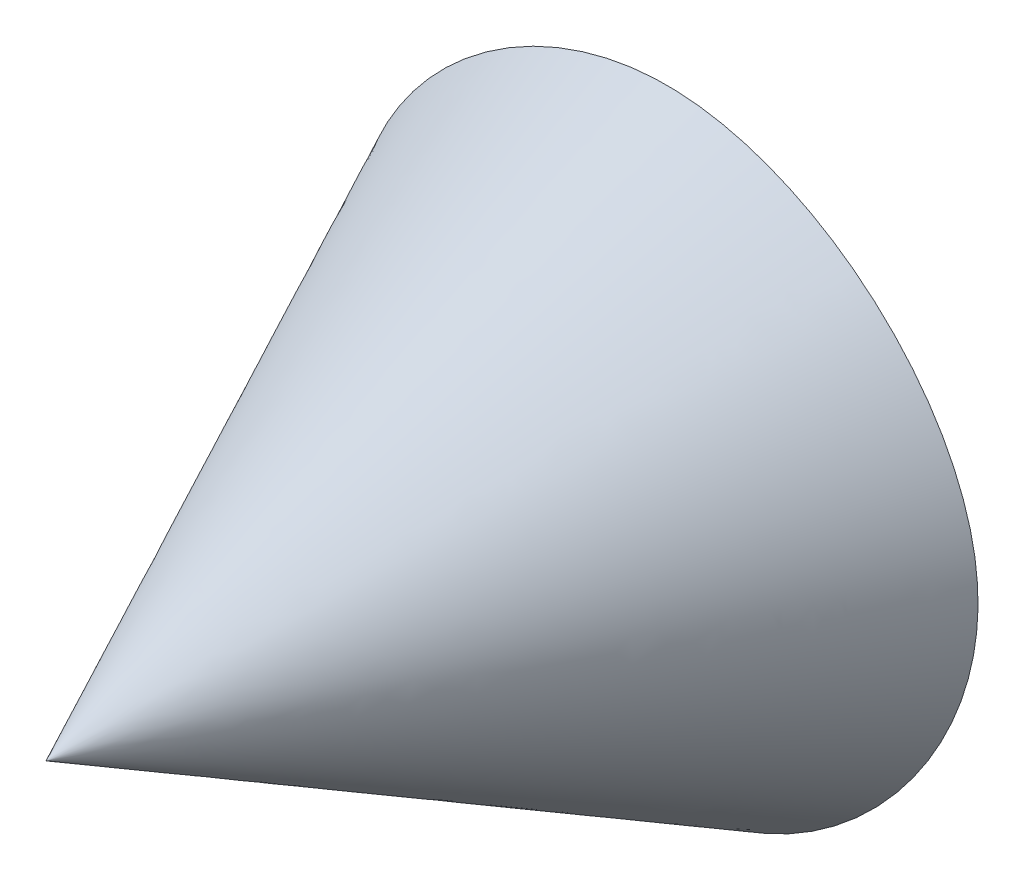
ISO-10303-21;
HEADER;
FILE_DESCRIPTION(('STEP AP214'),'2;1');
FILE_NAME('part.step','',(''),(''),'','','');
FILE_SCHEMA(('AUTOMOTIVE_DESIGN { 1 0 10303 214 1 1 1 1 }'));
ENDSEC;
DATA;
#1=APPLICATION_CONTEXT('core data for automotive mechanical design processes');
#2=APPLICATION_PROTOCOL_DEFINITION('international standard','automotive_design',2000,#1);
#3=PRODUCT_CONTEXT('',#1,'mechanical');
#4=PRODUCT('Part','Part','',(#3));
#5=PRODUCT_RELATED_PRODUCT_CATEGORY('part','',(#4));
#6=PRODUCT_DEFINITION_FORMATION('','',#4);
#7=PRODUCT_DEFINITION_CONTEXT('part definition',#1,'design');
#8=PRODUCT_DEFINITION('design','',#6,#7);
#9=PRODUCT_DEFINITION_SHAPE('','',#8);
#10=(LENGTH_UNIT() NAMED_UNIT(*) SI_UNIT(.MILLI.,.METRE.));
#11=(NAMED_UNIT(*) PLANE_ANGLE_UNIT() SI_UNIT($,.RADIAN.));
#12=(NAMED_UNIT(*) SI_UNIT($,.STERADIAN.) SOLID_ANGLE_UNIT());
#13=UNCERTAINTY_MEASURE_WITH_UNIT(LENGTH_MEASURE(1.E-05),#10,'distance_accuracy_value','');
#14=(GEOMETRIC_REPRESENTATION_CONTEXT(3) GLOBAL_UNCERTAINTY_ASSIGNED_CONTEXT((#13)) GLOBAL_UNIT_ASSIGNED_CONTEXT((#10,
#11,#12)) REPRESENTATION_CONTEXT('',''));
#15=CARTESIAN_POINT('',(0.,0.,0.));
#16=DIRECTION('',(0.,0.,1.));
#17=DIRECTION('',(1.,0.,0.));
#18=AXIS2_PLACEMENT_3D('',#15,#16,#17);
#19=CARTESIAN_POINT('',(-51.6655042028423,-8.36973373688102,0.));
#20=CARTESIAN_POINT('',(0.,-18.9795472267203,107.63836113147));
#21=CARTESIAN_POINT('',(-52.8573949781235,-11.8114570168603,0.));
#22=CARTESIAN_POINT('',(0.,-18.9795472267203,107.63836113147));
#23=CARTESIAN_POINT('',(-59.6364907834369,-43.1655659113786,0.));
#24=CARTESIAN_POINT('',(0.,-18.9795472267203,107.63836113147));
#25=CARTESIAN_POINT('',(0.,-110.56339711708,0.));
#26=CARTESIAN_POINT('',(0.,-18.9795472267203,107.63836113147));
#27=CARTESIAN_POINT('',(81.0817281648802,-18.9293563320875,0.));
#28=CARTESIAN_POINT('',(0.,-18.9795472267203,107.63836113147));
#29=CARTESIAN_POINT('',(3.72256988487083,47.9787589338983,0.));
#30=CARTESIAN_POINT('',(0.,-18.9795472267203,107.63836113147));
#31=CARTESIAN_POINT('',(-44.5357809097938,12.2181717544636,0.));
#32=CARTESIAN_POINT('',(0.,-18.9795472267203,107.63836113147));
#33=CARTESIAN_POINT('',(-51.6655042028423,-8.36973373688102,0.));
#34=CARTESIAN_POINT('',(0.,-18.9795472267203,107.63836113147));
#35=B_SPLINE_SURFACE_WITH_KNOTS('',3,1,((#19,#20),(#21,#22),(#23,#24),(#25,#26),(#27,#28),(#29,
#30),(#31,#32),(#33,#34)),.UNSPECIFIED.,.T.,.F.,.F.,(4,1,1,1,1,4),(2,2),(0.,0.0337854802750968,
0.29790000000013,0.562014519725161,0.797900000000128,1.),(0.,1.),.UNSPECIFIED.);
#36=CARTESIAN_POINT('',(-51.6655042028423,-8.36973373688102,0.));
#37=CARTESIAN_POINT('',(-52.8573949781235,-11.8114570168603,0.));
#38=CARTESIAN_POINT('',(-59.6364907834369,-43.1655659113786,0.));
#39=CARTESIAN_POINT('',(0.,-110.56339711708,0.));
#40=CARTESIAN_POINT('',(81.0817281648802,-18.9293563320875,0.));
#41=CARTESIAN_POINT('',(3.72256988487083,47.9787589338983,0.));
#42=CARTESIAN_POINT('',(-44.5357809097938,12.2181717544636,0.));
#43=CARTESIAN_POINT('',(-51.6655042028423,-8.36973373688102,0.));
#44=B_SPLINE_CURVE_WITH_KNOTS('',3,(#36,#37,#38,#39,#40,#41,#42,#43),.UNSPECIFIED.,.T.,.F.,(4,1,
1,1,1,4),(0.,0.0337854802750968,0.29790000000013,0.562014519725161,0.797900000000128,1.),.UNSPECIFIED.);
#45=CARTESIAN_POINT('',(-51.6655042028423,-8.36973373688102,0.));
#46=VERTEX_POINT('',#45);
#47=EDGE_CURVE('E13',#46,#46,#44,.T.);
#48=CARTESIAN_POINT('',(0.,-18.9795472267203,107.63836113147));
#49=VERTEX_POINT('',#48);
#50=VERTEX_LOOP('',#49);
#51=FACE_BOUND('',#50,.T.);
#52=ORIENTED_EDGE('',*,*,#47,.T.);
#53=EDGE_LOOP('',(#52));
#54=FACE_BOUND('',#53,.T.);
#55=ADVANCED_FACE('F54',(#51,#54),#35,.T.);
#56=OPEN_SHELL('',(#55));
#57=SHELL_BASED_SURFACE_MODEL('B2',(#56));
#58=CARTESIAN_POINT('',(0.,0.,0.));
#59=DIRECTION('',(0.,0.984807753012207,0.173648177666938));
#60=DIRECTION('',(0.,-0.173648177666938,0.984807753012207));
#61=AXIS2_PLACEMENT_3D('',#58,#59,#60);
#62=PLANE('',#61);
#63=DIRECTION('',(0.297033985078253,0.165810898462754,-0.940360333946252));
#64=VECTOR('',#63,1.);
#65=CARTESIAN_POINT('',(34.,0.,0.));
#66=LINE('',#65,#64);
#67=CARTESIAN_POINT('',(0.,-18.9795472267203,107.63836113147));
#68=VERTEX_POINT('',#67);
#69=CARTESIAN_POINT('',(34.,0.,0.));
#70=VERTEX_POINT('',#69);
#71=EDGE_CURVE('E128',#68,#70,#66,.T.);
#72=ORIENTED_EDGE('',*,*,#71,.F.);
#73=DIRECTION('',(0.297033985078253,-0.165810898462754,0.940360333946252));
#74=VECTOR('',#73,1.);
#75=CARTESIAN_POINT('',(0.,-18.9795472267203,107.63836113147));
#76=LINE('',#75,#74);
#77=CARTESIAN_POINT('',(-34.,0.,0.));
#78=VERTEX_POINT('',#77);
#79=EDGE_CURVE('E104',#78,#68,#76,.T.);
#80=ORIENTED_EDGE('',*,*,#79,.F.);
#81=DIRECTION('',(-1.,0.,0.));
#82=VECTOR('',#81,1.);
#83=CARTESIAN_POINT('',(-34.,0.,0.));
#84=LINE('',#83,#82);
#85=EDGE_CURVE('E118',#70,#78,#84,.T.);
#86=ORIENTED_EDGE('',*,*,#85,.F.);
#87=EDGE_LOOP('',(#72,#80,#86));
#88=FACE_BOUND('',#87,.T.);
#89=ADVANCED_FACE('F85',(#88),#62,.F.);
#90=CARTESIAN_POINT('',(3.94661527435034,10.4437777966632,3.08814710434931));
#91=DIRECTION('',(0.340700630809268,0.901583112618117,0.266591393724543));
#92=DIRECTION('',(-0.935436907850643,0.35349369362243,0.));
#93=AXIS2_PLACEMENT_3D('',#90,#91,#92);
#94=PLANE('',#93);
#95=DIRECTION('',(0.,-0.28355603058247,0.958955670258179));
#96=VECTOR('',#95,1.);
#97=CARTESIAN_POINT('',(0.,12.2116161373514,2.15323740307003));
#98=LINE('',#97,#96);
#99=CARTESIAN_POINT('',(0.,12.2116161373514,2.15323740307003));
#100=VERTEX_POINT('',#99);
#101=EDGE_CURVE('E108',#100,#68,#98,.T.);
#102=ORIENTED_EDGE('',*,*,#101,.T.);
#103=ORIENTED_EDGE('',*,*,#71,.T.);
#104=DIRECTION('',(0.93947030108257,-0.337425020272419,-0.0594971350401313));
#105=VECTOR('',#104,1.);
#106=CARTESIAN_POINT('',(0.,12.2116161373514,2.15323740307003));
#107=LINE('',#106,#105);
#108=EDGE_CURVE('E97',#100,#70,#107,.T.);
#109=ORIENTED_EDGE('',*,*,#108,.F.);
#110=EDGE_LOOP('',(#102,#103,#109));
#111=FACE_BOUND('',#110,.T.);
#112=ADVANCED_FACE('F144',(#111),#94,.T.);
#113=CARTESIAN_POINT('',(0.,0.,0.));
#114=DIRECTION('',(0.,0.173648177666938,-0.984807753012207));
#115=DIRECTION('',(0.,0.984807753012207,0.173648177666938));
#116=AXIS2_PLACEMENT_3D('',#113,#114,#115);
#117=PLANE('',#116);
#118=ORIENTED_EDGE('',*,*,#108,.T.);
#119=ORIENTED_EDGE('',*,*,#85,.T.);
#120=DIRECTION('',(-0.93947030108257,-0.337425020272419,-0.0594971350401309));
#121=VECTOR('',#120,1.);
#122=CARTESIAN_POINT('',(0.,12.2116161373514,2.15323740307003));
#123=LINE('',#122,#121);
#124=EDGE_CURVE('E52',#100,#78,#123,.T.);
#125=ORIENTED_EDGE('',*,*,#124,.F.);
#126=EDGE_LOOP('',(#118,#119,#125));
#127=FACE_BOUND('',#126,.T.);
#128=ADVANCED_FACE('F120',(#127),#117,.T.);
#129=CARTESIAN_POINT('',(-3.94661527435034,10.4437777966632,3.08814710434931));
#130=DIRECTION('',(-0.340700630809268,0.901583112618117,0.266591393724543));
#131=DIRECTION('',(-0.935436907850643,-0.35349369362243,0.));
#132=AXIS2_PLACEMENT_3D('',#129,#130,#131);
#133=PLANE('',#132);
#134=ORIENTED_EDGE('',*,*,#124,.T.);
#135=ORIENTED_EDGE('',*,*,#79,.T.);
#136=ORIENTED_EDGE('',*,*,#101,.F.);
#137=EDGE_LOOP('',(#134,#135,#136));
#138=FACE_BOUND('',#137,.T.);
#139=ADVANCED_FACE('F87',(#138),#133,.T.);
#140=CLOSED_SHELL('',(#89,#112,#128,#139));
#141=MANIFOLD_SOLID_BREP('B7',#140);
#142=ADVANCED_BREP_SHAPE_REPRESENTATION('',(#18,#141),#14);
#143=MANIFOLD_SURFACE_SHAPE_REPRESENTATION('',(#18,#57),#14);
#144=SHAPE_REPRESENTATION('',(#18),#14);
#145=SHAPE_DEFINITION_REPRESENTATION(#9,#144);
#146=SHAPE_REPRESENTATION_RELATIONSHIP('','',#144,#142);
#147=SHAPE_REPRESENTATION_RELATIONSHIP('','',#144,#143);
ENDSEC;
END-ISO-10303-21;
